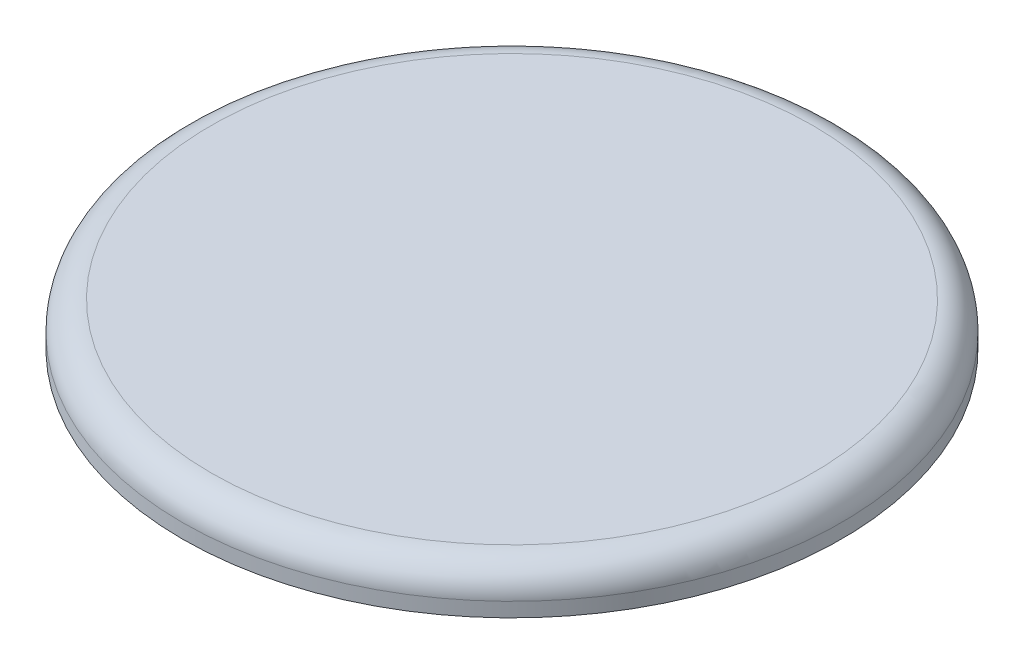
ISO-10303-21;
HEADER;
FILE_DESCRIPTION(('STEP AP214'),'2;1');
FILE_NAME('part.step','',(''),(''),'','','');
FILE_SCHEMA(('AUTOMOTIVE_DESIGN { 1 0 10303 214 1 1 1 1 }'));
ENDSEC;
DATA;
#1=APPLICATION_CONTEXT('core data for automotive mechanical design processes');
#2=APPLICATION_PROTOCOL_DEFINITION('international standard','automotive_design',2000,#1);
#3=PRODUCT_CONTEXT('',#1,'mechanical');
#4=PRODUCT('Part','Part','',(#3));
#5=PRODUCT_RELATED_PRODUCT_CATEGORY('part','',(#4));
#6=PRODUCT_DEFINITION_FORMATION('','',#4);
#7=PRODUCT_DEFINITION_CONTEXT('part definition',#1,'design');
#8=PRODUCT_DEFINITION('design','',#6,#7);
#9=PRODUCT_DEFINITION_SHAPE('','',#8);
#10=(LENGTH_UNIT() NAMED_UNIT(*) SI_UNIT(.MILLI.,.METRE.));
#11=(NAMED_UNIT(*) PLANE_ANGLE_UNIT() SI_UNIT($,.RADIAN.));
#12=(NAMED_UNIT(*) SI_UNIT($,.STERADIAN.) SOLID_ANGLE_UNIT());
#13=UNCERTAINTY_MEASURE_WITH_UNIT(LENGTH_MEASURE(1.E-05),#10,'distance_accuracy_value','');
#14=(GEOMETRIC_REPRESENTATION_CONTEXT(3) GLOBAL_UNCERTAINTY_ASSIGNED_CONTEXT((#13)) GLOBAL_UNIT_ASSIGNED_CONTEXT((#10,
#11,#12)) REPRESENTATION_CONTEXT('',''));
#15=CARTESIAN_POINT('',(0.,0.,0.));
#16=DIRECTION('',(0.,0.,1.));
#17=DIRECTION('',(1.,0.,0.));
#18=AXIS2_PLACEMENT_3D('',#15,#16,#17);
#19=CARTESIAN_POINT('',(0.,5.5,0.));
#20=DIRECTION('',(0.,-1.,0.));
#21=DIRECTION('',(0.,0.,-1.));
#22=AXIS2_PLACEMENT_3D('',#19,#20,#21);
#23=PLANE('',#22);
#24=CARTESIAN_POINT('',(0.,5.50000000000001,0.));
#25=DIRECTION('',(0.,1.,0.));
#26=DIRECTION('',(0.,0.,1.));
#27=AXIS2_PLACEMENT_3D('',#24,#25,#26);
#28=CIRCLE('',#27,21.);
#29=CARTESIAN_POINT('',(0.,5.50000000000001,21.));
#30=VERTEX_POINT('',#29);
#31=EDGE_CURVE('E10',#30,#30,#28,.T.);
#32=ORIENTED_EDGE('',*,*,#31,.T.);
#33=EDGE_LOOP('',(#32));
#34=FACE_BOUND('',#33,.T.);
#35=ADVANCED_FACE('F32',(#34),#23,.F.);
#36=CARTESIAN_POINT('',(0.,3.5,0.));
#37=DIRECTION('',(0.,1.,0.));
#38=DIRECTION('',(0.,0.,1.));
#39=AXIS2_PLACEMENT_3D('',#36,#37,#38);
#40=TOROIDAL_SURFACE('',#39,21.,2.);
#41=ORIENTED_EDGE('',*,*,#31,.F.);
#42=EDGE_LOOP('',(#41));
#43=FACE_BOUND('',#42,.T.);
#44=CARTESIAN_POINT('',(0.,3.49999999999999,0.));
#45=DIRECTION('',(0.,1.,0.));
#46=DIRECTION('',(0.,0.,1.));
#47=AXIS2_PLACEMENT_3D('',#44,#45,#46);
#48=CIRCLE('',#47,23.);
#49=CARTESIAN_POINT('',(0.,3.49999999999999,23.));
#50=VERTEX_POINT('',#49);
#51=EDGE_CURVE('E38',#50,#50,#48,.T.);
#52=ORIENTED_EDGE('',*,*,#51,.T.);
#53=EDGE_LOOP('',(#52));
#54=FACE_BOUND('',#53,.T.);
#55=ADVANCED_FACE('F73',(#43,#54),#40,.T.);
#56=CARTESIAN_POINT('',(0.,31.9156521739131,0.));
#57=DIRECTION('',(0.,1.,0.));
#58=DIRECTION('',(0.,0.,1.));
#59=AXIS2_PLACEMENT_3D('',#56,#57,#58);
#60=CYLINDRICAL_SURFACE('',#59,23.);
#61=ORIENTED_EDGE('',*,*,#51,.F.);
#62=EDGE_LOOP('',(#61));
#63=FACE_BOUND('',#62,.T.);
#64=CARTESIAN_POINT('',(0.,2.5,0.));
#65=DIRECTION('',(0.,1.,0.));
#66=DIRECTION('',(0.,0.,1.));
#67=AXIS2_PLACEMENT_3D('',#64,#65,#66);
#68=CIRCLE('',#67,23.);
#69=CARTESIAN_POINT('',(0.,2.5,23.));
#70=VERTEX_POINT('',#69);
#71=EDGE_CURVE('E42',#70,#70,#68,.T.);
#72=ORIENTED_EDGE('',*,*,#71,.T.);
#73=EDGE_LOOP('',(#72));
#74=FACE_BOUND('',#73,.T.);
#75=ADVANCED_FACE('F77',(#63,#74),#60,.T.);
#76=CARTESIAN_POINT('',(23.,2.5,0.));
#77=DIRECTION('',(0.,1.,0.));
#78=DIRECTION('',(0.,0.,1.));
#79=AXIS2_PLACEMENT_3D('',#76,#77,#78);
#80=PLANE('',#79);
#81=ORIENTED_EDGE('',*,*,#71,.F.);
#82=EDGE_LOOP('',(#81));
#83=FACE_BOUND('',#82,.T.);
#84=CARTESIAN_POINT('',(0.,2.5,0.));
#85=DIRECTION('',(0.,1.,0.));
#86=DIRECTION('',(0.,0.,1.));
#87=AXIS2_PLACEMENT_3D('',#84,#85,#86);
#88=CIRCLE('',#87,19.);
#89=CARTESIAN_POINT('',(0.,2.5,19.));
#90=VERTEX_POINT('',#89);
#91=EDGE_CURVE('E46',#90,#90,#88,.T.);
#92=ORIENTED_EDGE('',*,*,#91,.T.);
#93=EDGE_LOOP('',(#92));
#94=FACE_BOUND('',#93,.T.);
#95=ADVANCED_FACE('F82',(#83,#94),#80,.F.);
#96=CARTESIAN_POINT('',(0.,31.9156521739131,0.));
#97=DIRECTION('',(0.,1.,0.));
#98=DIRECTION('',(0.,0.,1.));
#99=AXIS2_PLACEMENT_3D('',#96,#97,#98);
#100=CYLINDRICAL_SURFACE('',#99,19.);
#101=ORIENTED_EDGE('',*,*,#91,.F.);
#102=EDGE_LOOP('',(#101));
#103=FACE_BOUND('',#102,.T.);
#104=CARTESIAN_POINT('',(0.,0.,0.));
#105=DIRECTION('',(0.,1.,0.));
#106=DIRECTION('',(0.,0.,1.));
#107=AXIS2_PLACEMENT_3D('',#104,#105,#106);
#108=CIRCLE('',#107,19.);
#109=CARTESIAN_POINT('',(0.,0.,19.));
#110=VERTEX_POINT('',#109);
#111=EDGE_CURVE('E51',#110,#110,#108,.T.);
#112=ORIENTED_EDGE('',*,*,#111,.T.);
#113=EDGE_LOOP('',(#112));
#114=FACE_BOUND('',#113,.T.);
#115=ADVANCED_FACE('F88',(#103,#114),#100,.T.);
#116=CARTESIAN_POINT('',(19.,0.,0.));
#117=DIRECTION('',(0.,1.,0.));
#118=DIRECTION('',(0.,0.,1.));
#119=AXIS2_PLACEMENT_3D('',#116,#117,#118);
#120=PLANE('',#119);
#121=ORIENTED_EDGE('',*,*,#111,.F.);
#122=EDGE_LOOP('',(#121));
#123=FACE_BOUND('',#122,.T.);
#124=CARTESIAN_POINT('',(0.,0.,0.));
#125=DIRECTION('',(0.,1.,0.));
#126=DIRECTION('',(0.,0.,1.));
#127=AXIS2_PLACEMENT_3D('',#124,#125,#126);
#128=CIRCLE('',#127,17.);
#129=CARTESIAN_POINT('',(0.,0.,17.));
#130=VERTEX_POINT('',#129);
#131=EDGE_CURVE('E54',#130,#130,#128,.T.);
#132=ORIENTED_EDGE('',*,*,#131,.T.);
#133=EDGE_LOOP('',(#132));
#134=FACE_BOUND('',#133,.T.);
#135=ADVANCED_FACE('F69',(#123,#134),#120,.F.);
#136=CARTESIAN_POINT('',(0.,31.9156521739131,0.));
#137=DIRECTION('',(0.,1.,0.));
#138=DIRECTION('',(0.,0.,1.));
#139=AXIS2_PLACEMENT_3D('',#136,#137,#138);
#140=CYLINDRICAL_SURFACE('',#139,17.);
#141=ORIENTED_EDGE('',*,*,#131,.F.);
#142=EDGE_LOOP('',(#141));
#143=FACE_BOUND('',#142,.T.);
#144=CARTESIAN_POINT('',(0.,2.5,0.));
#145=DIRECTION('',(0.,1.,0.));
#146=DIRECTION('',(0.,0.,1.));
#147=AXIS2_PLACEMENT_3D('',#144,#145,#146);
#148=CIRCLE('',#147,17.);
#149=CARTESIAN_POINT('',(0.,2.5,17.));
#150=VERTEX_POINT('',#149);
#151=EDGE_CURVE('E57',#150,#150,#148,.T.);
#152=ORIENTED_EDGE('',*,*,#151,.T.);
#153=EDGE_LOOP('',(#152));
#154=FACE_BOUND('',#153,.T.);
#155=ADVANCED_FACE('F61',(#143,#154),#140,.F.);
#156=CARTESIAN_POINT('',(17.,2.5,0.));
#157=DIRECTION('',(0.,1.,0.));
#158=DIRECTION('',(0.,0.,1.));
#159=AXIS2_PLACEMENT_3D('',#156,#157,#158);
#160=PLANE('',#159);
#161=ORIENTED_EDGE('',*,*,#151,.F.);
#162=EDGE_LOOP('',(#161));
#163=FACE_BOUND('',#162,.T.);
#164=ADVANCED_FACE('F63',(#163),#160,.F.);
#165=CLOSED_SHELL('',(#35,#55,#75,#95,#115,#135,#155,#164));
#166=MANIFOLD_SOLID_BREP('B2',#165);
#167=ADVANCED_BREP_SHAPE_REPRESENTATION('',(#18,#166),#14);
#168=SHAPE_DEFINITION_REPRESENTATION(#9,#167);
ENDSEC;
END-ISO-10303-21;
